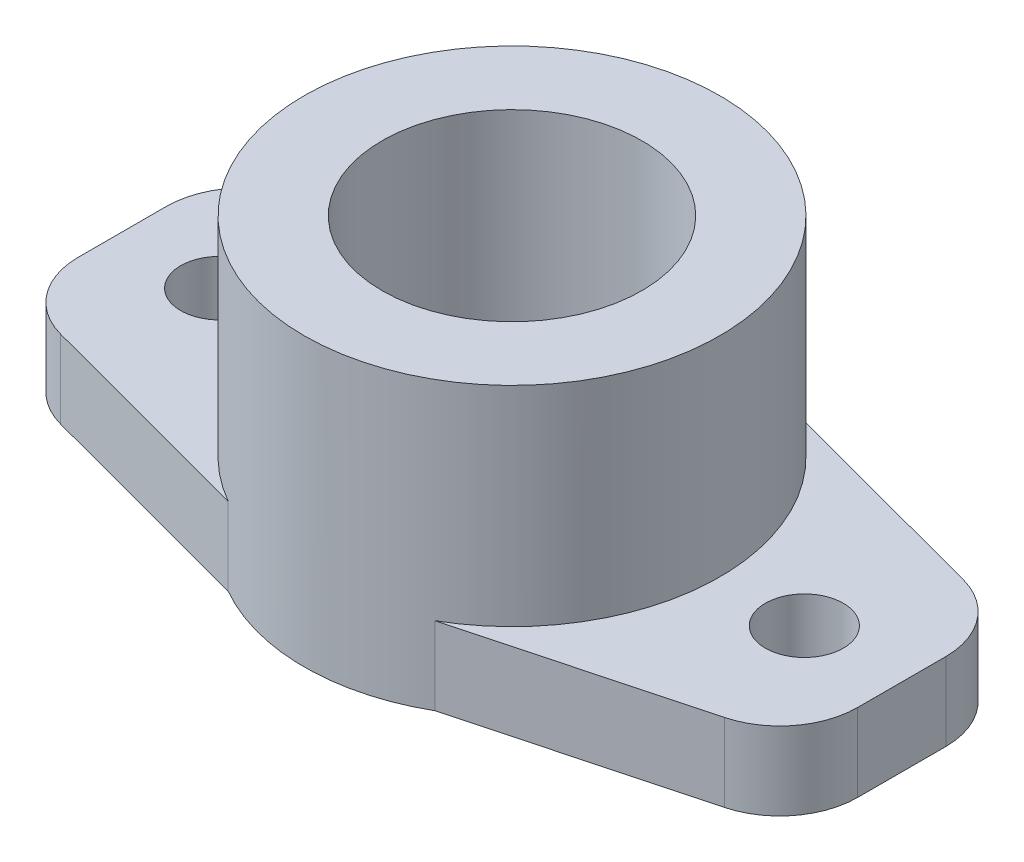
ISO-10303-21;
HEADER;
FILE_DESCRIPTION(('STEP AP214'),'2;1');
FILE_NAME('part.step','',(''),(''),'','','');
FILE_SCHEMA(('AUTOMOTIVE_DESIGN { 1 0 10303 214 1 1 1 1 }'));
ENDSEC;
DATA;
#1=APPLICATION_CONTEXT('core data for automotive mechanical design processes');
#2=APPLICATION_PROTOCOL_DEFINITION('international standard','automotive_design',2000,#1);
#3=PRODUCT_CONTEXT('',#1,'mechanical');
#4=PRODUCT('Part','Part','',(#3));
#5=PRODUCT_RELATED_PRODUCT_CATEGORY('part','',(#4));
#6=PRODUCT_DEFINITION_FORMATION('','',#4);
#7=PRODUCT_DEFINITION_CONTEXT('part definition',#1,'design');
#8=PRODUCT_DEFINITION('design','',#6,#7);
#9=PRODUCT_DEFINITION_SHAPE('','',#8);
#10=(LENGTH_UNIT() NAMED_UNIT(*) SI_UNIT(.MILLI.,.METRE.));
#11=(NAMED_UNIT(*) PLANE_ANGLE_UNIT() SI_UNIT($,.RADIAN.));
#12=(NAMED_UNIT(*) SI_UNIT($,.STERADIAN.) SOLID_ANGLE_UNIT());
#13=UNCERTAINTY_MEASURE_WITH_UNIT(LENGTH_MEASURE(1.E-05),#10,'distance_accuracy_value','');
#14=(GEOMETRIC_REPRESENTATION_CONTEXT(3) GLOBAL_UNCERTAINTY_ASSIGNED_CONTEXT((#13)) GLOBAL_UNIT_ASSIGNED_CONTEXT((#10,
#11,#12)) REPRESENTATION_CONTEXT('',''));
#15=CARTESIAN_POINT('',(0.,0.,0.));
#16=DIRECTION('',(0.,0.,1.));
#17=DIRECTION('',(1.,0.,0.));
#18=AXIS2_PLACEMENT_3D('',#15,#16,#17);
#19=CARTESIAN_POINT('',(15.,3.,-8.));
#20=DIRECTION('',(0.,1.,0.));
#21=DIRECTION('',(0.,0.,1.));
#22=AXIS2_PLACEMENT_3D('',#19,#20,#21);
#23=PLANE('',#22);
#24=CARTESIAN_POINT('',(15.,3.,-8.));
#25=DIRECTION('',(0.,1.,0.));
#26=DIRECTION('',(0.,0.,1.));
#27=AXIS2_PLACEMENT_3D('',#24,#25,#26);
#28=CIRCLE('',#27,8.00000000000001);
#29=CARTESIAN_POINT('',(18.9834024896266,3.,-1.06224066390042));
#30=VERTEX_POINT('',#29);
#31=CARTESIAN_POINT('',(18.9834024896266,3.,-14.9377593360996));
#32=VERTEX_POINT('',#31);
#33=EDGE_CURVE('E50',#30,#32,#28,.T.);
#34=ORIENTED_EDGE('',*,*,#33,.F.);
#35=DIRECTION('',(0.966234939601246,0.,-0.257662650560332));
#36=VECTOR('',#35,1.);
#37=CARTESIAN_POINT('',(18.9834024896266,3.,-1.06224066390042));
#38=LINE('',#37,#36);
#39=CARTESIAN_POINT('',(27.772987951681,3.,-3.40613012044827));
#40=VERTEX_POINT('',#39);
#41=EDGE_CURVE('E134',#30,#40,#38,.T.);
#42=ORIENTED_EDGE('',*,*,#41,.T.);
#43=CARTESIAN_POINT('',(27.,3.,-6.30483493925201));
#44=DIRECTION('',(0.,1.,0.));
#45=DIRECTION('',(0.,0.,1.));
#46=AXIS2_PLACEMENT_3D('',#43,#44,#45);
#47=CIRCLE('',#46,3.);
#48=CARTESIAN_POINT('',(30.,3.,-6.30483493925201));
#49=VERTEX_POINT('',#48);
#50=EDGE_CURVE('E261',#40,#49,#47,.T.);
#51=ORIENTED_EDGE('',*,*,#50,.T.);
#52=DIRECTION('',(0.,0.,-1.));
#53=VECTOR('',#52,1.);
#54=CARTESIAN_POINT('',(30.,3.,-4.));
#55=LINE('',#54,#53);
#56=CARTESIAN_POINT('',(30.,3.,-9.695165060748));
#57=VERTEX_POINT('',#56);
#58=EDGE_CURVE('E144',#49,#57,#55,.T.);
#59=ORIENTED_EDGE('',*,*,#58,.T.);
#60=CARTESIAN_POINT('',(27.,3.,-9.695165060748));
#61=DIRECTION('',(0.,1.,0.));
#62=DIRECTION('',(0.,0.,1.));
#63=AXIS2_PLACEMENT_3D('',#60,#61,#62);
#64=CIRCLE('',#63,3.);
#65=CARTESIAN_POINT('',(27.772987951681,3.,-12.5938698795517));
#66=VERTEX_POINT('',#65);
#67=EDGE_CURVE('E65',#57,#66,#64,.T.);
#68=ORIENTED_EDGE('',*,*,#67,.T.);
#69=DIRECTION('',(-0.966234939601246,0.,-0.257662650560332));
#70=VECTOR('',#69,1.);
#71=CARTESIAN_POINT('',(18.9834024896266,3.,-14.9377593360996));
#72=LINE('',#71,#70);
#73=EDGE_CURVE('E159',#66,#32,#72,.T.);
#74=ORIENTED_EDGE('',*,*,#73,.T.);
#75=EDGE_LOOP('',(#34,#42,#51,#59,#68,#74));
#76=FACE_BOUND('',#75,.T.);
#77=CARTESIAN_POINT('',(26.25,3.,-8.));
#78=DIRECTION('',(0.,1.,0.));
#79=DIRECTION('',(0.,0.,1.));
#80=AXIS2_PLACEMENT_3D('',#77,#78,#79);
#81=CIRCLE('',#80,1.5);
#82=CARTESIAN_POINT('',(26.25,3.,-6.5));
#83=VERTEX_POINT('',#82);
#84=EDGE_CURVE('E180',#83,#83,#81,.T.);
#85=ORIENTED_EDGE('',*,*,#84,.F.);
#86=EDGE_LOOP('',(#85));
#87=FACE_BOUND('',#86,.T.);
#88=ADVANCED_FACE('F39',(#76,#87),#23,.T.);
#89=CARTESIAN_POINT('',(11.0165975103734,3.,-14.9377593360996));
#90=VERTEX_POINT('',#89);
#91=CARTESIAN_POINT('',(11.0165975103734,3.,-1.06224066390042));
#92=VERTEX_POINT('',#91);
#93=EDGE_CURVE('E11',#90,#92,#28,.T.);
#94=ORIENTED_EDGE('',*,*,#93,.F.);
#95=DIRECTION('',(-0.966234939601246,0.,0.257662650560332));
#96=VECTOR('',#95,1.);
#97=CARTESIAN_POINT('',(11.0165975103734,3.,-14.9377593360996));
#98=LINE('',#97,#96);
#99=CARTESIAN_POINT('',(2.227012048319,3.,-12.5938698795517));
#100=VERTEX_POINT('',#99);
#101=EDGE_CURVE('E196',#90,#100,#98,.T.);
#102=ORIENTED_EDGE('',*,*,#101,.T.);
#103=CARTESIAN_POINT('',(3.,3.,-9.69516506074799));
#104=DIRECTION('',(0.,1.,0.));
#105=DIRECTION('',(0.,0.,1.));
#106=AXIS2_PLACEMENT_3D('',#103,#104,#105);
#107=CIRCLE('',#106,3.);
#108=CARTESIAN_POINT('',(0.,3.,-9.69516506074799));
#109=VERTEX_POINT('',#108);
#110=EDGE_CURVE('E266',#100,#109,#107,.T.);
#111=ORIENTED_EDGE('',*,*,#110,.T.);
#112=DIRECTION('',(0.,0.,1.));
#113=VECTOR('',#112,1.);
#114=CARTESIAN_POINT('',(0.,3.,-12.));
#115=LINE('',#114,#113);
#116=CARTESIAN_POINT('',(0.,3.,-6.30483493925201));
#117=VERTEX_POINT('',#116);
#118=EDGE_CURVE('E199',#109,#117,#115,.T.);
#119=ORIENTED_EDGE('',*,*,#118,.T.);
#120=CARTESIAN_POINT('',(3.,3.,-6.30483493925201));
#121=DIRECTION('',(0.,1.,0.));
#122=DIRECTION('',(0.,0.,1.));
#123=AXIS2_PLACEMENT_3D('',#120,#121,#122);
#124=CIRCLE('',#123,3.);
#125=CARTESIAN_POINT('',(2.227012048319,3.,-3.40613012044827));
#126=VERTEX_POINT('',#125);
#127=EDGE_CURVE('E269',#117,#126,#124,.T.);
#128=ORIENTED_EDGE('',*,*,#127,.T.);
#129=DIRECTION('',(0.966234939601246,0.,0.257662650560332));
#130=VECTOR('',#129,1.);
#131=CARTESIAN_POINT('',(11.0165975103734,3.,-1.06224066390042));
#132=LINE('',#131,#130);
#133=EDGE_CURVE('E156',#126,#92,#132,.T.);
#134=ORIENTED_EDGE('',*,*,#133,.T.);
#135=EDGE_LOOP('',(#94,#102,#111,#119,#128,#134));
#136=FACE_BOUND('',#135,.T.);
#137=CARTESIAN_POINT('',(3.75,3.,-8.));
#138=DIRECTION('',(0.,1.,0.));
#139=DIRECTION('',(0.,0.,-1.));
#140=AXIS2_PLACEMENT_3D('',#137,#138,#139);
#141=CIRCLE('',#140,1.5);
#142=CARTESIAN_POINT('',(3.75,3.,-9.5));
#143=VERTEX_POINT('',#142);
#144=EDGE_CURVE('E172',#143,#143,#141,.T.);
#145=ORIENTED_EDGE('',*,*,#144,.F.);
#146=EDGE_LOOP('',(#145));
#147=FACE_BOUND('',#146,.T.);
#148=ADVANCED_FACE('F306',(#136,#147),#23,.T.);
#149=CARTESIAN_POINT('',(15.,0.,-8.));
#150=DIRECTION('',(0.,1.,0.));
#151=DIRECTION('',(0.,0.,1.));
#152=AXIS2_PLACEMENT_3D('',#149,#150,#151);
#153=PLANE('',#152);
#154=DIRECTION('',(0.966234939601246,0.,0.257662650560332));
#155=VECTOR('',#154,1.);
#156=CARTESIAN_POINT('',(11.0165975103734,0.,-1.06224066390042));
#157=LINE('',#156,#155);
#158=CARTESIAN_POINT('',(2.227012048319,0.,-3.40613012044827));
#159=VERTEX_POINT('',#158);
#160=CARTESIAN_POINT('',(11.0165975103734,0.,-1.06224066390042));
#161=VERTEX_POINT('',#160);
#162=EDGE_CURVE('E224',#159,#161,#157,.T.);
#163=ORIENTED_EDGE('',*,*,#162,.F.);
#164=CARTESIAN_POINT('',(3.,0.,-6.30483493925201));
#165=DIRECTION('',(0.,1.,0.));
#166=DIRECTION('',(0.,0.,1.));
#167=AXIS2_PLACEMENT_3D('',#164,#165,#166);
#168=CIRCLE('',#167,3.);
#169=CARTESIAN_POINT('',(0.,0.,-6.30483493925201));
#170=VERTEX_POINT('',#169);
#171=EDGE_CURVE('E251',#159,#170,#168,.F.);
#172=ORIENTED_EDGE('',*,*,#171,.T.);
#173=DIRECTION('',(0.,0.,1.));
#174=VECTOR('',#173,1.);
#175=CARTESIAN_POINT('',(0.,0.,-12.));
#176=LINE('',#175,#174);
#177=CARTESIAN_POINT('',(0.,0.,-9.69516506074799));
#178=VERTEX_POINT('',#177);
#179=EDGE_CURVE('E220',#178,#170,#176,.T.);
#180=ORIENTED_EDGE('',*,*,#179,.F.);
#181=CARTESIAN_POINT('',(3.,0.,-9.69516506074799));
#182=DIRECTION('',(0.,1.,0.));
#183=DIRECTION('',(0.,0.,1.));
#184=AXIS2_PLACEMENT_3D('',#181,#182,#183);
#185=CIRCLE('',#184,3.);
#186=CARTESIAN_POINT('',(2.227012048319,0.,-12.5938698795517));
#187=VERTEX_POINT('',#186);
#188=EDGE_CURVE('E248',#178,#187,#185,.F.);
#189=ORIENTED_EDGE('',*,*,#188,.T.);
#190=DIRECTION('',(-0.966234939601246,0.,0.257662650560332));
#191=VECTOR('',#190,1.);
#192=CARTESIAN_POINT('',(11.0165975103734,0.,-14.9377593360996));
#193=LINE('',#192,#191);
#194=CARTESIAN_POINT('',(11.0165975103734,0.,-14.9377593360996));
#195=VERTEX_POINT('',#194);
#196=EDGE_CURVE('E217',#195,#187,#193,.T.);
#197=ORIENTED_EDGE('',*,*,#196,.F.);
#198=CARTESIAN_POINT('',(15.,0.,-8.));
#199=DIRECTION('',(0.,1.,0.));
#200=DIRECTION('',(0.,0.,1.));
#201=AXIS2_PLACEMENT_3D('',#198,#199,#200);
#202=CIRCLE('',#201,8.);
#203=CARTESIAN_POINT('',(18.9834024896266,0.,-14.9377593360996));
#204=VERTEX_POINT('',#203);
#205=EDGE_CURVE('E214',#204,#195,#202,.T.);
#206=ORIENTED_EDGE('',*,*,#205,.F.);
#207=DIRECTION('',(-0.966234939601246,0.,-0.257662650560332));
#208=VECTOR('',#207,1.);
#209=CARTESIAN_POINT('',(18.9834024896266,0.,-14.9377593360996));
#210=LINE('',#209,#208);
#211=CARTESIAN_POINT('',(27.772987951681,0.,-12.5938698795517));
#212=VERTEX_POINT('',#211);
#213=EDGE_CURVE('E211',#212,#204,#210,.T.);
#214=ORIENTED_EDGE('',*,*,#213,.F.);
#215=CARTESIAN_POINT('',(27.,0.,-9.695165060748));
#216=DIRECTION('',(0.,1.,0.));
#217=DIRECTION('',(0.,0.,1.));
#218=AXIS2_PLACEMENT_3D('',#215,#216,#217);
#219=CIRCLE('',#218,3.);
#220=CARTESIAN_POINT('',(30.,0.,-9.695165060748));
#221=VERTEX_POINT('',#220);
#222=EDGE_CURVE('E245',#212,#221,#219,.F.);
#223=ORIENTED_EDGE('',*,*,#222,.T.);
#224=DIRECTION('',(0.,0.,-1.));
#225=VECTOR('',#224,1.);
#226=CARTESIAN_POINT('',(30.,0.,-4.));
#227=LINE('',#226,#225);
#228=CARTESIAN_POINT('',(30.,0.,-6.30483493925201));
#229=VERTEX_POINT('',#228);
#230=EDGE_CURVE('E207',#229,#221,#227,.T.);
#231=ORIENTED_EDGE('',*,*,#230,.F.);
#232=CARTESIAN_POINT('',(27.,0.,-6.30483493925201));
#233=DIRECTION('',(0.,1.,0.));
#234=DIRECTION('',(0.,0.,1.));
#235=AXIS2_PLACEMENT_3D('',#232,#233,#234);
#236=CIRCLE('',#235,3.);
#237=CARTESIAN_POINT('',(27.772987951681,0.,-3.40613012044827));
#238=VERTEX_POINT('',#237);
#239=EDGE_CURVE('E242',#229,#238,#236,.F.);
#240=ORIENTED_EDGE('',*,*,#239,.T.);
#241=DIRECTION('',(0.966234939601246,0.,-0.257662650560332));
#242=VECTOR('',#241,1.);
#243=CARTESIAN_POINT('',(18.9834024896266,0.,-1.06224066390042));
#244=LINE('',#243,#242);
#245=CARTESIAN_POINT('',(18.9834024896266,0.,-1.06224066390042));
#246=VERTEX_POINT('',#245);
#247=EDGE_CURVE('E190',#246,#238,#244,.T.);
#248=ORIENTED_EDGE('',*,*,#247,.F.);
#249=CARTESIAN_POINT('',(15.,0.,-8.));
#250=DIRECTION('',(0.,1.,0.));
#251=DIRECTION('',(0.,0.,1.));
#252=AXIS2_PLACEMENT_3D('',#249,#250,#251);
#253=CIRCLE('',#252,8.00000000000001);
#254=EDGE_CURVE('E145',#161,#246,#253,.T.);
#255=ORIENTED_EDGE('',*,*,#254,.F.);
#256=EDGE_LOOP('',(#163,#172,#180,#189,#197,#206,#214,#223,#231,#240,#248,#255));
#257=FACE_BOUND('',#256,.T.);
#258=CARTESIAN_POINT('',(15.,0.,-8.));
#259=DIRECTION('',(0.,1.,0.));
#260=DIRECTION('',(0.,0.,1.));
#261=AXIS2_PLACEMENT_3D('',#258,#259,#260);
#262=CIRCLE('',#261,5.);
#263=CARTESIAN_POINT('',(15.,0.,-3.));
#264=VERTEX_POINT('',#263);
#265=EDGE_CURVE('E184',#264,#264,#262,.T.);
#266=ORIENTED_EDGE('',*,*,#265,.T.);
#267=EDGE_LOOP('',(#266));
#268=FACE_BOUND('',#267,.T.);
#269=CARTESIAN_POINT('',(26.25,0.,-8.));
#270=DIRECTION('',(0.,1.,0.));
#271=DIRECTION('',(0.,0.,1.));
#272=AXIS2_PLACEMENT_3D('',#269,#270,#271);
#273=CIRCLE('',#272,1.5);
#274=CARTESIAN_POINT('',(26.25,0.,-6.5));
#275=VERTEX_POINT('',#274);
#276=EDGE_CURVE('E176',#275,#275,#273,.T.);
#277=ORIENTED_EDGE('',*,*,#276,.T.);
#278=EDGE_LOOP('',(#277));
#279=FACE_BOUND('',#278,.T.);
#280=CARTESIAN_POINT('',(3.75,0.,-8.));
#281=DIRECTION('',(0.,1.,0.));
#282=DIRECTION('',(0.,0.,-1.));
#283=AXIS2_PLACEMENT_3D('',#280,#281,#282);
#284=CIRCLE('',#283,1.5);
#285=CARTESIAN_POINT('',(3.75,0.,-9.5));
#286=VERTEX_POINT('',#285);
#287=EDGE_CURVE('E167',#286,#286,#284,.T.);
#288=ORIENTED_EDGE('',*,*,#287,.T.);
#289=EDGE_LOOP('',(#288));
#290=FACE_BOUND('',#289,.T.);
#291=ADVANCED_FACE('F299',(#257,#268,#279,#290),#153,.F.);
#292=CARTESIAN_POINT('',(18.9834024896266,3.,-1.06224066390042));
#293=DIRECTION('',(-0.257662650560332,0.,-0.966234939601246));
#294=DIRECTION('',(-0.966234939601247,0.,0.257662650560332));
#295=AXIS2_PLACEMENT_3D('',#292,#293,#294);
#296=PLANE('',#295);
#297=ORIENTED_EDGE('',*,*,#247,.T.);
#298=DIRECTION('',(0.,-1.,0.));
#299=VECTOR('',#298,1.);
#300=CARTESIAN_POINT('',(27.772987951681,3.,-3.40613012044827));
#301=LINE('',#300,#299);
#302=EDGE_CURVE('E43',#238,#40,#301,.F.);
#303=ORIENTED_EDGE('',*,*,#302,.T.);
#304=ORIENTED_EDGE('',*,*,#41,.F.);
#305=DIRECTION('',(0.,-1.,0.));
#306=VECTOR('',#305,1.);
#307=CARTESIAN_POINT('',(18.9834024896266,3.,-1.06224066390042));
#308=LINE('',#307,#306);
#309=EDGE_CURVE('E138',#30,#246,#308,.T.);
#310=ORIENTED_EDGE('',*,*,#309,.T.);
#311=EDGE_LOOP('',(#297,#303,#304,#310));
#312=FACE_BOUND('',#311,.T.);
#313=ADVANCED_FACE('F137',(#312),#296,.F.);
#314=CARTESIAN_POINT('',(30.,3.,-4.));
#315=DIRECTION('',(-1.,0.,0.));
#316=DIRECTION('',(0.,0.,1.));
#317=AXIS2_PLACEMENT_3D('',#314,#315,#316);
#318=PLANE('',#317);
#319=ORIENTED_EDGE('',*,*,#230,.T.);
#320=DIRECTION('',(0.,-1.,0.));
#321=VECTOR('',#320,1.);
#322=CARTESIAN_POINT('',(30.,3.,-9.695165060748));
#323=LINE('',#322,#321);
#324=EDGE_CURVE('E281',#221,#57,#323,.F.);
#325=ORIENTED_EDGE('',*,*,#324,.T.);
#326=ORIENTED_EDGE('',*,*,#58,.F.);
#327=DIRECTION('',(0.,-1.,0.));
#328=VECTOR('',#327,1.);
#329=CARTESIAN_POINT('',(30.,3.,-6.30483493925201));
#330=LINE('',#329,#328);
#331=EDGE_CURVE('E278',#49,#229,#330,.T.);
#332=ORIENTED_EDGE('',*,*,#331,.T.);
#333=EDGE_LOOP('',(#319,#325,#326,#332));
#334=FACE_BOUND('',#333,.T.);
#335=ADVANCED_FACE('F287',(#334),#318,.F.);
#336=CARTESIAN_POINT('',(18.9834024896266,3.,-14.9377593360996));
#337=DIRECTION('',(-0.257662650560332,0.,0.966234939601246));
#338=DIRECTION('',(0.966234939601247,0.,0.257662650560332));
#339=AXIS2_PLACEMENT_3D('',#336,#337,#338);
#340=PLANE('',#339);
#341=ORIENTED_EDGE('',*,*,#73,.F.);
#342=DIRECTION('',(0.,-1.,0.));
#343=VECTOR('',#342,1.);
#344=CARTESIAN_POINT('',(27.772987951681,3.,-12.5938698795517));
#345=LINE('',#344,#343);
#346=EDGE_CURVE('E274',#66,#212,#345,.T.);
#347=ORIENTED_EDGE('',*,*,#346,.T.);
#348=ORIENTED_EDGE('',*,*,#213,.T.);
#349=DIRECTION('',(0.,-1.,0.));
#350=VECTOR('',#349,1.);
#351=CARTESIAN_POINT('',(18.9834024896266,3.,-14.9377593360996));
#352=LINE('',#351,#350);
#353=EDGE_CURVE('E235',#32,#204,#352,.T.);
#354=ORIENTED_EDGE('',*,*,#353,.F.);
#355=EDGE_LOOP('',(#341,#347,#348,#354));
#356=FACE_BOUND('',#355,.T.);
#357=ADVANCED_FACE('F295',(#356),#340,.F.);
#358=CARTESIAN_POINT('',(11.0165975103734,3.,-14.9377593360996));
#359=DIRECTION('',(0.257662650560332,0.,0.966234939601246));
#360=DIRECTION('',(0.966234939601246,0.,-0.257662650560332));
#361=AXIS2_PLACEMENT_3D('',#358,#359,#360);
#362=PLANE('',#361);
#363=ORIENTED_EDGE('',*,*,#196,.T.);
#364=DIRECTION('',(0.,-1.,0.));
#365=VECTOR('',#364,1.);
#366=CARTESIAN_POINT('',(2.227012048319,3.,-12.5938698795517));
#367=LINE('',#366,#365);
#368=EDGE_CURVE('E57',#187,#100,#367,.F.);
#369=ORIENTED_EDGE('',*,*,#368,.T.);
#370=ORIENTED_EDGE('',*,*,#101,.F.);
#371=DIRECTION('',(0.,-1.,0.));
#372=VECTOR('',#371,1.);
#373=CARTESIAN_POINT('',(11.0165975103734,3.,-14.9377593360996));
#374=LINE('',#373,#372);
#375=EDGE_CURVE('E231',#90,#195,#374,.T.);
#376=ORIENTED_EDGE('',*,*,#375,.T.);
#377=EDGE_LOOP('',(#363,#369,#370,#376));
#378=FACE_BOUND('',#377,.T.);
#379=ADVANCED_FACE('F303',(#378),#362,.F.);
#380=CARTESIAN_POINT('',(0.,3.,-12.));
#381=DIRECTION('',(1.,0.,0.));
#382=DIRECTION('',(0.,0.,-1.));
#383=AXIS2_PLACEMENT_3D('',#380,#381,#382);
#384=PLANE('',#383);
#385=ORIENTED_EDGE('',*,*,#179,.T.);
#386=DIRECTION('',(0.,-1.,0.));
#387=VECTOR('',#386,1.);
#388=CARTESIAN_POINT('',(0.,3.,-6.30483493925201));
#389=LINE('',#388,#387);
#390=EDGE_CURVE('E258',#170,#117,#389,.F.);
#391=ORIENTED_EDGE('',*,*,#390,.T.);
#392=ORIENTED_EDGE('',*,*,#118,.F.);
#393=DIRECTION('',(0.,-1.,0.));
#394=VECTOR('',#393,1.);
#395=CARTESIAN_POINT('',(0.,3.,-9.69516506074799));
#396=LINE('',#395,#394);
#397=EDGE_CURVE('E254',#109,#178,#396,.T.);
#398=ORIENTED_EDGE('',*,*,#397,.T.);
#399=EDGE_LOOP('',(#385,#391,#392,#398));
#400=FACE_BOUND('',#399,.T.);
#401=ADVANCED_FACE('F314',(#400),#384,.F.);
#402=CARTESIAN_POINT('',(11.0165975103734,3.,-1.06224066390042));
#403=DIRECTION('',(0.257662650560332,0.,-0.966234939601246));
#404=DIRECTION('',(-0.966234939601247,0.,-0.257662650560332));
#405=AXIS2_PLACEMENT_3D('',#402,#403,#404);
#406=PLANE('',#405);
#407=ORIENTED_EDGE('',*,*,#133,.F.);
#408=DIRECTION('',(0.,-1.,0.));
#409=VECTOR('',#408,1.);
#410=CARTESIAN_POINT('',(2.227012048319,3.,-3.40613012044827));
#411=LINE('',#410,#409);
#412=EDGE_CURVE('E238',#126,#159,#411,.T.);
#413=ORIENTED_EDGE('',*,*,#412,.T.);
#414=ORIENTED_EDGE('',*,*,#162,.T.);
#415=DIRECTION('',(0.,-1.,0.));
#416=VECTOR('',#415,1.);
#417=CARTESIAN_POINT('',(11.0165975103734,3.,-1.06224066390042));
#418=LINE('',#417,#416);
#419=EDGE_CURVE('E155',#92,#161,#418,.T.);
#420=ORIENTED_EDGE('',*,*,#419,.F.);
#421=EDGE_LOOP('',(#407,#413,#414,#420));
#422=FACE_BOUND('',#421,.T.);
#423=ADVANCED_FACE('F322',(#422),#406,.F.);
#424=CARTESIAN_POINT('',(15.,3.,-8.));
#425=DIRECTION('',(0.,-1.,0.));
#426=DIRECTION('',(0.,0.,-1.));
#427=AXIS2_PLACEMENT_3D('',#424,#425,#426);
#428=CYLINDRICAL_SURFACE('',#427,8.00000000000001);
#429=ORIENTED_EDGE('',*,*,#254,.T.);
#430=ORIENTED_EDGE('',*,*,#309,.F.);
#431=ORIENTED_EDGE('',*,*,#33,.T.);
#432=ORIENTED_EDGE('',*,*,#353,.T.);
#433=ORIENTED_EDGE('',*,*,#205,.T.);
#434=ORIENTED_EDGE('',*,*,#375,.F.);
#435=ORIENTED_EDGE('',*,*,#93,.T.);
#436=ORIENTED_EDGE('',*,*,#419,.T.);
#437=EDGE_LOOP('',(#429,#430,#431,#432,#433,#434,#435,#436));
#438=FACE_BOUND('',#437,.T.);
#439=CARTESIAN_POINT('',(15.,11.04,-8.));
#440=DIRECTION('',(0.,1.,0.));
#441=DIRECTION('',(0.,0.,1.));
#442=AXIS2_PLACEMENT_3D('',#439,#440,#441);
#443=CIRCLE('',#442,8.00000000000001);
#444=CARTESIAN_POINT('',(15.,11.04,0.));
#445=VERTEX_POINT('',#444);
#446=EDGE_CURVE('E162',#445,#445,#443,.T.);
#447=ORIENTED_EDGE('',*,*,#446,.F.);
#448=EDGE_LOOP('',(#447));
#449=FACE_BOUND('',#448,.T.);
#450=ADVANCED_FACE('F149',(#438,#449),#428,.T.);
#451=CARTESIAN_POINT('',(15.,3.,-8.));
#452=DIRECTION('',(0.,-1.,0.));
#453=DIRECTION('',(0.,0.,-1.));
#454=AXIS2_PLACEMENT_3D('',#451,#452,#453);
#455=CYLINDRICAL_SURFACE('',#454,5.);
#456=ORIENTED_EDGE('',*,*,#265,.F.);
#457=EDGE_LOOP('',(#456));
#458=FACE_BOUND('',#457,.T.);
#459=CARTESIAN_POINT('',(15.,11.04,-8.));
#460=DIRECTION('',(0.,1.,0.));
#461=DIRECTION('',(0.,0.,1.));
#462=AXIS2_PLACEMENT_3D('',#459,#460,#461);
#463=CIRCLE('',#462,5.);
#464=CARTESIAN_POINT('',(15.,11.04,-3.));
#465=VERTEX_POINT('',#464);
#466=EDGE_CURVE('E163',#465,#465,#463,.T.);
#467=ORIENTED_EDGE('',*,*,#466,.T.);
#468=EDGE_LOOP('',(#467));
#469=FACE_BOUND('',#468,.T.);
#470=ADVANCED_FACE('F340',(#458,#469),#455,.F.);
#471=CARTESIAN_POINT('',(26.25,3.,-8.));
#472=DIRECTION('',(0.,-1.,0.));
#473=DIRECTION('',(0.,0.,-1.));
#474=AXIS2_PLACEMENT_3D('',#471,#472,#473);
#475=CYLINDRICAL_SURFACE('',#474,1.5);
#476=ORIENTED_EDGE('',*,*,#84,.T.);
#477=EDGE_LOOP('',(#476));
#478=FACE_BOUND('',#477,.T.);
#479=ORIENTED_EDGE('',*,*,#276,.F.);
#480=EDGE_LOOP('',(#479));
#481=FACE_BOUND('',#480,.T.);
#482=ADVANCED_FACE('F423',(#478,#481),#475,.F.);
#483=CARTESIAN_POINT('',(3.75,3.,-8.));
#484=DIRECTION('',(0.,-1.,0.));
#485=DIRECTION('',(0.,0.,-1.));
#486=AXIS2_PLACEMENT_3D('',#483,#484,#485);
#487=CYLINDRICAL_SURFACE('',#486,1.5);
#488=ORIENTED_EDGE('',*,*,#144,.T.);
#489=EDGE_LOOP('',(#488));
#490=FACE_BOUND('',#489,.T.);
#491=ORIENTED_EDGE('',*,*,#287,.F.);
#492=EDGE_LOOP('',(#491));
#493=FACE_BOUND('',#492,.T.);
#494=ADVANCED_FACE('F360',(#490,#493),#487,.F.);
#495=CARTESIAN_POINT('',(3.,3.,-6.30483493925201));
#496=DIRECTION('',(0.,-1.,0.));
#497=DIRECTION('',(0.,0.,-1.));
#498=AXIS2_PLACEMENT_3D('',#495,#496,#497);
#499=CYLINDRICAL_SURFACE('',#498,3.);
#500=ORIENTED_EDGE('',*,*,#127,.F.);
#501=ORIENTED_EDGE('',*,*,#390,.F.);
#502=ORIENTED_EDGE('',*,*,#171,.F.);
#503=ORIENTED_EDGE('',*,*,#412,.F.);
#504=EDGE_LOOP('',(#500,#501,#502,#503));
#505=FACE_BOUND('',#504,.T.);
#506=ADVANCED_FACE('F319',(#505),#499,.T.);
#507=CARTESIAN_POINT('',(3.,3.,-9.69516506074799));
#508=DIRECTION('',(0.,-1.,0.));
#509=DIRECTION('',(0.,0.,-1.));
#510=AXIS2_PLACEMENT_3D('',#507,#508,#509);
#511=CYLINDRICAL_SURFACE('',#510,3.);
#512=ORIENTED_EDGE('',*,*,#110,.F.);
#513=ORIENTED_EDGE('',*,*,#368,.F.);
#514=ORIENTED_EDGE('',*,*,#188,.F.);
#515=ORIENTED_EDGE('',*,*,#397,.F.);
#516=EDGE_LOOP('',(#512,#513,#514,#515));
#517=FACE_BOUND('',#516,.T.);
#518=ADVANCED_FACE('F311',(#517),#511,.T.);
#519=CARTESIAN_POINT('',(27.,3.,-9.695165060748));
#520=DIRECTION('',(0.,-1.,0.));
#521=DIRECTION('',(0.,0.,-1.));
#522=AXIS2_PLACEMENT_3D('',#519,#520,#521);
#523=CYLINDRICAL_SURFACE('',#522,3.);
#524=ORIENTED_EDGE('',*,*,#67,.F.);
#525=ORIENTED_EDGE('',*,*,#324,.F.);
#526=ORIENTED_EDGE('',*,*,#222,.F.);
#527=ORIENTED_EDGE('',*,*,#346,.F.);
#528=EDGE_LOOP('',(#524,#525,#526,#527));
#529=FACE_BOUND('',#528,.T.);
#530=ADVANCED_FACE('F292',(#529),#523,.T.);
#531=CARTESIAN_POINT('',(27.,3.,-6.30483493925201));
#532=DIRECTION('',(0.,-1.,0.));
#533=DIRECTION('',(0.,0.,-1.));
#534=AXIS2_PLACEMENT_3D('',#531,#532,#533);
#535=CYLINDRICAL_SURFACE('',#534,3.);
#536=ORIENTED_EDGE('',*,*,#50,.F.);
#537=ORIENTED_EDGE('',*,*,#302,.F.);
#538=ORIENTED_EDGE('',*,*,#239,.F.);
#539=ORIENTED_EDGE('',*,*,#331,.F.);
#540=EDGE_LOOP('',(#536,#537,#538,#539));
#541=FACE_BOUND('',#540,.T.);
#542=ADVANCED_FACE('F41',(#541),#535,.T.);
#543=CARTESIAN_POINT('',(15.,11.04,-8.));
#544=DIRECTION('',(0.,1.,0.));
#545=DIRECTION('',(0.,0.,1.));
#546=AXIS2_PLACEMENT_3D('',#543,#544,#545);
#547=PLANE('',#546);
#548=ORIENTED_EDGE('',*,*,#446,.T.);
#549=EDGE_LOOP('',(#548));
#550=FACE_BOUND('',#549,.T.);
#551=ORIENTED_EDGE('',*,*,#466,.F.);
#552=EDGE_LOOP('',(#551));
#553=FACE_BOUND('',#552,.T.);
#554=ADVANCED_FACE('F326',(#550,#553),#547,.T.);
#555=CLOSED_SHELL('',(#88,#148,#291,#313,#335,#357,#379,#401,#423,#450,#470,#482,#494,#506,#518,
#530,#542,#554));
#556=MANIFOLD_SOLID_BREP('B2',#555);
#557=ADVANCED_BREP_SHAPE_REPRESENTATION('',(#18,#556),#14);
#558=SHAPE_DEFINITION_REPRESENTATION(#9,#557);
ENDSEC;
END-ISO-10303-21;
